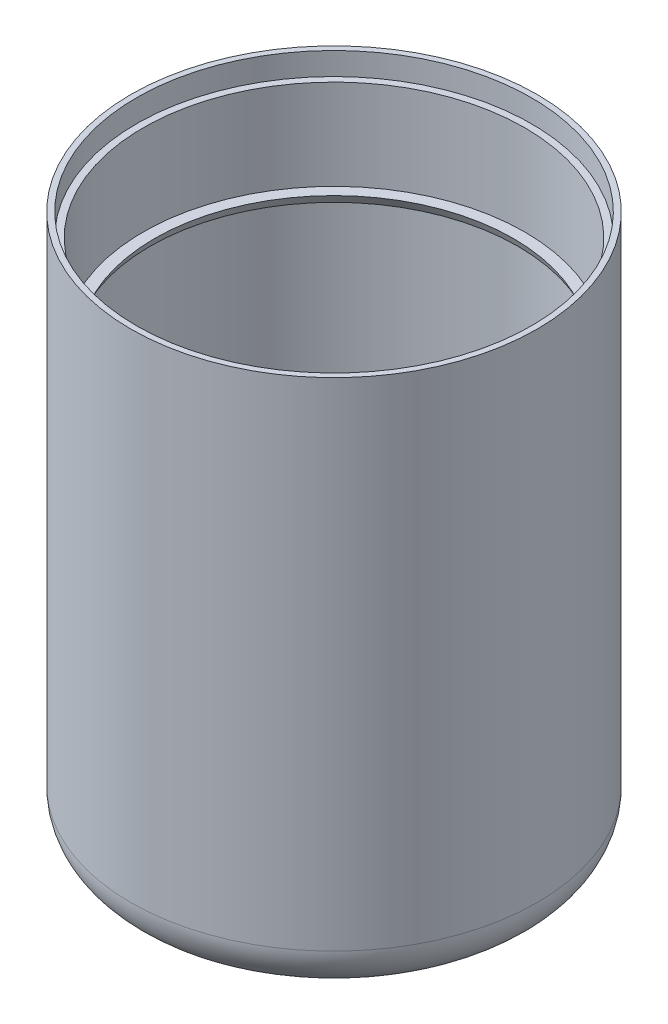
ISO-10303-21;
HEADER;
FILE_DESCRIPTION(('STEP AP214'),'2;1');
FILE_NAME('part.step','',(''),(''),'','','');
FILE_SCHEMA(('AUTOMOTIVE_DESIGN { 1 0 10303 214 1 1 1 1 }'));
ENDSEC;
DATA;
#1=APPLICATION_CONTEXT('core data for automotive mechanical design processes');
#2=APPLICATION_PROTOCOL_DEFINITION('international standard','automotive_design',2000,#1);
#3=PRODUCT_CONTEXT('',#1,'mechanical');
#4=PRODUCT('Part','Part','',(#3));
#5=PRODUCT_RELATED_PRODUCT_CATEGORY('part','',(#4));
#6=PRODUCT_DEFINITION_FORMATION('','',#4);
#7=PRODUCT_DEFINITION_CONTEXT('part definition',#1,'design');
#8=PRODUCT_DEFINITION('design','',#6,#7);
#9=PRODUCT_DEFINITION_SHAPE('','',#8);
#10=(LENGTH_UNIT() NAMED_UNIT(*) SI_UNIT(.MILLI.,.METRE.));
#11=(NAMED_UNIT(*) PLANE_ANGLE_UNIT() SI_UNIT($,.RADIAN.));
#12=(NAMED_UNIT(*) SI_UNIT($,.STERADIAN.) SOLID_ANGLE_UNIT());
#13=UNCERTAINTY_MEASURE_WITH_UNIT(LENGTH_MEASURE(1.E-05),#10,'distance_accuracy_value','');
#14=(GEOMETRIC_REPRESENTATION_CONTEXT(3) GLOBAL_UNCERTAINTY_ASSIGNED_CONTEXT((#13)) GLOBAL_UNIT_ASSIGNED_CONTEXT((#10,
#11,#12)) REPRESENTATION_CONTEXT('',''));
#15=CARTESIAN_POINT('',(0.,0.,0.));
#16=DIRECTION('',(0.,0.,1.));
#17=DIRECTION('',(1.,0.,0.));
#18=AXIS2_PLACEMENT_3D('',#15,#16,#17);
#19=CARTESIAN_POINT('',(0.,48.8080404796562,0.));
#20=DIRECTION('',(0.,1.,0.));
#21=DIRECTION('',(0.,0.,1.));
#22=AXIS2_PLACEMENT_3D('',#19,#20,#21);
#23=CYLINDRICAL_SURFACE('',#22,45.);
#24=CARTESIAN_POINT('',(0.,-7.,-45.));
#25=CARTESIAN_POINT('',(0.168310772412375,-7.00000739664471,-44.9999986739539));
#26=CARTESIAN_POINT('',(0.336738816143234,-7.01421186288798,-44.9990456232156));
#27=CARTESIAN_POINT('',(0.668942560382783,-7.07067147920369,-44.9953353411301));
#28=CARTESIAN_POINT('',(0.83271264204624,-7.11295912390083,-44.9925760198272));
#29=CARTESIAN_POINT('',(1.15074050207909,-7.22436362536326,-44.9855652903156));
#30=CARTESIAN_POINT('',(1.30500331209652,-7.29346614678751,-44.9813146794725));
#31=CARTESIAN_POINT('',(1.59970039584897,-7.45651515151363,-44.9717991985665));
#32=CARTESIAN_POINT('',(1.7401377895456,-7.55045601186526,-44.9665345581348));
#33=CARTESIAN_POINT('',(2.00347379837653,-7.76068780174807,-44.9555726925818));
#34=CARTESIAN_POINT('',(2.12634602003576,-7.87701176153062,-44.9498748357835));
#35=CARTESIAN_POINT('',(2.35083790313255,-8.12863921538396,-44.9386940934982));
#36=CARTESIAN_POINT('',(2.45245666867831,-8.2639435091267,-44.9332112170811));
#37=CARTESIAN_POINT('',(2.63164038098009,-8.54984287398833,-44.9230738010164));
#38=CARTESIAN_POINT('',(2.70918308797913,-8.70045191313798,-44.9184200289175));
#39=CARTESIAN_POINT('',(2.8378712921748,-9.01258772349034,-44.9104739180579));
#40=CARTESIAN_POINT('',(2.88901710538416,-9.17411436396584,-44.907181562999));
#41=CARTESIAN_POINT('',(2.96338559817866,-9.50324333382937,-44.9023356529058));
#42=CARTESIAN_POINT('',(2.98665004928268,-9.67083618580105,-44.9007794969612));
#43=CARTESIAN_POINT('',(3.0047243925241,-10.0075548931784,-44.8995736891329));
#44=CARTESIAN_POINT('',(2.99953464437275,-10.1766807291775,-44.8999240131478));
#45=CARTESIAN_POINT('',(2.96088254031824,-10.5113796280459,-44.9024892451457));
#46=CARTESIAN_POINT('',(2.92746542023376,-10.676957940938,-44.904701169797));
#47=CARTESIAN_POINT('',(2.83337734677405,-11.0001498712854,-44.9107356473475));
#48=CARTESIAN_POINT('',(2.77270621176627,-11.1577634356525,-44.9145582109807));
#49=CARTESIAN_POINT('',(2.62578111033229,-11.4606969233812,-44.9233866374691));
#50=CARTESIAN_POINT('',(2.53950666352314,-11.6060068848923,-44.9283934469627));
#51=CARTESIAN_POINT('',(2.34383877876966,-11.8800994375337,-44.9390252169622));
#52=CARTESIAN_POINT('',(2.23444504394235,-12.0088818163932,-44.9446501854056));
#53=CARTESIAN_POINT('',(1.99538928249837,-12.2465267041827,-44.9558976521431));
#54=CARTESIAN_POINT('',(1.86568811459493,-12.3553498445859,-44.9615201241895));
#55=CARTESIAN_POINT('',(1.58983632497056,-12.5496833711595,-44.9721184703939));
#56=CARTESIAN_POINT('',(1.44368569673034,-12.6351937480905,-44.9770943442956));
#57=CARTESIAN_POINT('',(1.13905948420149,-12.7804712462028,-44.9858392857681));
#58=CARTESIAN_POINT('',(0.980583165272391,-12.8402368315431,-44.9896082813374));
#59=CARTESIAN_POINT('',(0.655814988240901,-12.9323016987052,-44.9955138283039));
#60=CARTESIAN_POINT('',(0.489523233995113,-12.9646013454034,-44.9976504013874));
#61=CARTESIAN_POINT('',(0.154186113373804,-13.0007685827697,-45.0000475603078));
#62=CARTESIAN_POINT('',(-0.0148533589405315,-13.0046905947422,-45.0003117369196));
#63=CARTESIAN_POINT('',(-0.351187715026798,-12.9841334911842,-44.9989438929593));
#64=CARTESIAN_POINT('',(-0.518482609141468,-12.9596545441257,-44.9973118836353));
#65=CARTESIAN_POINT('',(-0.846425281588111,-12.8830354589356,-44.9923376680918));
#66=CARTESIAN_POINT('',(-1.00707892952687,-12.8309203348672,-44.9889970085033));
#67=CARTESIAN_POINT('',(-1.31736002404258,-12.7005336829426,-44.9809812262275));
#68=CARTESIAN_POINT('',(-1.46698735791856,-12.622261887782,-44.9763060899027));
#69=CARTESIAN_POINT('',(-1.75121739414985,-12.4416455204174,-44.9661374966078));
#70=CARTESIAN_POINT('',(-1.88579698804049,-12.3392646534194,-44.960642810471));
#71=CARTESIAN_POINT('',(-2.13587858293946,-12.1133891172881,-44.9494574320514));
#72=CARTESIAN_POINT('',(-2.25138037086135,-11.9898942123562,-44.9437667375803));
#73=CARTESIAN_POINT('',(-2.46021244645348,-11.7250611296198,-44.9328202762595));
#74=CARTESIAN_POINT('',(-2.55350739106986,-11.5836950493482,-44.927565211279));
#75=CARTESIAN_POINT('',(-2.71503562232214,-11.2872724732904,-44.9180938633177));
#76=CARTESIAN_POINT('',(-2.78326908071165,-11.1322160713369,-44.9138775732179));
#77=CARTESIAN_POINT('',(-2.89267641518368,-10.8129427261022,-44.9069643438698));
#78=CARTESIAN_POINT('',(-2.93387242774451,-10.6487333964543,-44.9042661619536));
#79=CARTESIAN_POINT('',(-2.98810772460007,-10.315710005335,-44.9006899992897));
#80=CARTESIAN_POINT('',(-3.00114733434121,-10.1468959971098,-44.8998119975035));
#81=CARTESIAN_POINT('',(-2.99869645060436,-9.80980663109155,-44.8999757225186));
#82=CARTESIAN_POINT('',(-2.98326151391727,-9.64153086473065,-44.9010137110264));
#83=CARTESIAN_POINT('',(-2.92441498278543,-9.3099661975971,-44.9048845276191));
#84=CARTESIAN_POINT('',(-2.88100333884062,-9.14667730564841,-44.9077173588797));
#85=CARTESIAN_POINT('',(-2.76744851334852,-8.82971411720811,-44.914857708161));
#86=CARTESIAN_POINT('',(-2.69730571400754,-8.67603968328401,-44.9191652050966));
#87=CARTESIAN_POINT('',(-2.53228694212582,-8.3826407742445,-44.9287694439466));
#88=CARTESIAN_POINT('',(-2.43741156522086,-8.24291596329175,-44.9340661620366));
#89=CARTESIAN_POINT('',(-2.22541432483089,-7.98110008300132,-44.9450640887664));
#90=CARTESIAN_POINT('',(-2.108252023749,-7.8590417880043,-44.9507660206639));
#91=CARTESIAN_POINT('',(-1.85506627966413,-7.63628197219837,-44.9619255640595));
#92=CARTESIAN_POINT('',(-1.71903823833992,-7.53558567332871,-44.9673831155621));
#93=CARTESIAN_POINT('',(-1.43180879651668,-7.35832354736249,-44.9774453236686));
#94=CARTESIAN_POINT('',(-1.28058722391154,-7.28179037441845,-44.982048822669));
#95=CARTESIAN_POINT('',(-0.967518646258061,-7.15529491230508,-44.9898691308766));
#96=CARTESIAN_POINT('',(-0.805684294150342,-7.10530160588927,-44.9930875579858));
#97=CARTESIAN_POINT('',(-0.535721621316339,-7.04625253123539,-44.9969347133308));
#98=CARTESIAN_POINT('',(-0.429336852485932,-7.02893037004749,-44.99807906537));
#99=CARTESIAN_POINT('',(-0.21531738845897,-7.00580174748219,-44.9996121322942));
#100=CARTESIAN_POINT('',(-0.107682695256217,-6.99999526773821,-45.0000008483844));
#101=CARTESIAN_POINT('',(0.,-7.,-45.));
#102=B_SPLINE_CURVE_WITH_KNOTS('',3,(#24,#25,#26,#27,#28,#29,#30,#31,#32,#33,#34,#35,#36,#37,
#38,#39,#40,#41,#42,#43,#44,#45,#46,#47,#48,#49,#50,#51,#52,#53,#54,#55,#56,#57,#58,#59,#60,#61,
#62,#63,#64,#65,#66,#67,#68,#69,#70,#71,#72,#73,#74,#75,#76,#77,#78,#79,#80,#81,#82,#83,#84,#85,
#86,#87,#88,#89,#90,#91,#92,#93,#94,#95,#96,#97,#98,#99,#100,#101),.UNSPECIFIED.,.T.,.F.,(4,2,2,
2,2,2,2,2,2,2,2,2,2,2,2,2,2,2,2,2,2,2,2,2,2,2,2,2,2,2,2,2,2,2,2,2,2,2,4),(0.,0.504539202132875,
1.00966321855339,1.51451756484974,2.01925771897189,2.52474849986171,3.03026058428982,
3.53623824519497,4.04220984860343,4.54742246005173,5.05262868473679,5.55702682304439,
6.06142832292944,6.56623439192725,7.0710469437127,7.57684474723722,8.08264275122085,
8.58847092510423,9.09429237911222,9.5991435345889,10.1039916953495,10.6083836858095,
11.1127808309915,11.617942226472,12.1231092638885,12.6290749974734,13.1350372634642,
13.6405847624203,14.146126417963,14.6506827523698,15.155239979506,15.6597899926733,
16.1643278558622,16.6697900429335,17.1753756482046,17.6816416081085,18.1873145831146,
18.5101116746006,18.8329082512509),.UNSPECIFIED.);
#103=CARTESIAN_POINT('',(0.,-7.,-45.));
#104=VERTEX_POINT('',#103);
#105=EDGE_CURVE('E105',#104,#104,#102,.T.);
#106=ORIENTED_EDGE('',*,*,#105,.F.);
#107=EDGE_LOOP('',(#106));
#108=FACE_BOUND('',#107,.T.);
#109=CARTESIAN_POINT('',(0.,-55.,0.));
#110=DIRECTION('',(0.,1.,0.));
#111=DIRECTION('',(0.,0.,1.));
#112=AXIS2_PLACEMENT_3D('',#109,#110,#111);
#113=CIRCLE('',#112,45.);
#114=CARTESIAN_POINT('',(0.,-55.,45.));
#115=VERTEX_POINT('',#114);
#116=EDGE_CURVE('E10',#115,#115,#113,.T.);
#117=ORIENTED_EDGE('',*,*,#116,.T.);
#118=EDGE_LOOP('',(#117));
#119=FACE_BOUND('',#118,.T.);
#120=CARTESIAN_POINT('',(0.,55.,0.));
#121=DIRECTION('',(0.,1.,0.));
#122=DIRECTION('',(0.,0.,1.));
#123=AXIS2_PLACEMENT_3D('',#120,#121,#122);
#124=CIRCLE('',#123,45.);
#125=CARTESIAN_POINT('',(0.,55.,45.));
#126=VERTEX_POINT('',#125);
#127=EDGE_CURVE('E102',#126,#126,#124,.T.);
#128=ORIENTED_EDGE('',*,*,#127,.F.);
#129=EDGE_LOOP('',(#128));
#130=FACE_BOUND('',#129,.T.);
#131=ADVANCED_FACE('F32',(#108,#119,#130),#23,.T.);
#132=CARTESIAN_POINT('',(0.,-55.,0.));
#133=DIRECTION('',(0.,1.,0.));
#134=DIRECTION('',(0.,0.,1.));
#135=AXIS2_PLACEMENT_3D('',#132,#133,#134);
#136=TOROIDAL_SURFACE('',#135,35.,10.);
#137=CARTESIAN_POINT('',(0.,-65.,0.));
#138=DIRECTION('',(0.,1.,0.));
#139=DIRECTION('',(0.,0.,1.));
#140=AXIS2_PLACEMENT_3D('',#137,#138,#139);
#141=CIRCLE('',#140,35.);
#142=CARTESIAN_POINT('',(0.,-65.,35.));
#143=VERTEX_POINT('',#142);
#144=EDGE_CURVE('E45',#143,#143,#141,.T.);
#145=ORIENTED_EDGE('',*,*,#144,.T.);
#146=EDGE_LOOP('',(#145));
#147=FACE_BOUND('',#146,.T.);
#148=ORIENTED_EDGE('',*,*,#116,.F.);
#149=EDGE_LOOP('',(#148));
#150=FACE_BOUND('',#149,.T.);
#151=ADVANCED_FACE('F186',(#147,#150),#136,.T.);
#152=CARTESIAN_POINT('',(0.,-65.,0.));
#153=DIRECTION('',(0.,-1.,0.));
#154=DIRECTION('',(0.,0.,-1.));
#155=AXIS2_PLACEMENT_3D('',#152,#153,#154);
#156=PLANE('',#155);
#157=CARTESIAN_POINT('',(0.,-65.,0.));
#158=DIRECTION('',(0.,1.,0.));
#159=DIRECTION('',(0.,0.,1.));
#160=AXIS2_PLACEMENT_3D('',#157,#158,#159);
#161=CIRCLE('',#160,15.);
#162=CARTESIAN_POINT('',(0.,-65.,15.));
#163=VERTEX_POINT('',#162);
#164=EDGE_CURVE('E49',#163,#163,#161,.T.);
#165=ORIENTED_EDGE('',*,*,#164,.T.);
#166=EDGE_LOOP('',(#165));
#167=FACE_BOUND('',#166,.T.);
#168=ORIENTED_EDGE('',*,*,#144,.F.);
#169=EDGE_LOOP('',(#168));
#170=FACE_BOUND('',#169,.T.);
#171=ADVANCED_FACE('F183',(#167,#170),#156,.T.);
#172=CARTESIAN_POINT('',(0.,-75.,0.));
#173=DIRECTION('',(0.,1.,0.));
#174=DIRECTION('',(0.,0.,1.));
#175=AXIS2_PLACEMENT_3D('',#172,#173,#174);
#176=TOROIDAL_SURFACE('',#175,15.,10.);
#177=ORIENTED_EDGE('',*,*,#164,.F.);
#178=EDGE_LOOP('',(#177));
#179=FACE_BOUND('',#178,.T.);
#180=CARTESIAN_POINT('',(0.,-75.,0.));
#181=DIRECTION('',(0.,1.,0.));
#182=DIRECTION('',(0.,0.,1.));
#183=AXIS2_PLACEMENT_3D('',#180,#181,#182);
#184=CIRCLE('',#183,5.);
#185=CARTESIAN_POINT('',(0.,-75.,4.99999999999999));
#186=VERTEX_POINT('',#185);
#187=EDGE_CURVE('E54',#186,#186,#184,.T.);
#188=ORIENTED_EDGE('',*,*,#187,.T.);
#189=EDGE_LOOP('',(#188));
#190=FACE_BOUND('',#189,.T.);
#191=ADVANCED_FACE('F179',(#179,#190),#176,.F.);
#192=CARTESIAN_POINT('',(0.,48.8080404796562,0.));
#193=DIRECTION('',(0.,1.,0.));
#194=DIRECTION('',(0.,0.,1.));
#195=AXIS2_PLACEMENT_3D('',#192,#193,#194);
#196=CYLINDRICAL_SURFACE('',#195,5.);
#197=CARTESIAN_POINT('',(0.,-80.,0.));
#198=DIRECTION('',(0.,1.,0.));
#199=DIRECTION('',(0.,0.,1.));
#200=AXIS2_PLACEMENT_3D('',#197,#198,#199);
#201=CIRCLE('',#200,5.);
#202=CARTESIAN_POINT('',(0.,-80.,4.99999999999998));
#203=VERTEX_POINT('',#202);
#204=EDGE_CURVE('E57',#203,#203,#201,.T.);
#205=ORIENTED_EDGE('',*,*,#204,.T.);
#206=EDGE_LOOP('',(#205));
#207=FACE_BOUND('',#206,.T.);
#208=ORIENTED_EDGE('',*,*,#187,.F.);
#209=EDGE_LOOP('',(#208));
#210=FACE_BOUND('',#209,.T.);
#211=ADVANCED_FACE('F175',(#207,#210),#196,.T.);
#212=CARTESIAN_POINT('',(0.,-80.,0.));
#213=DIRECTION('',(0.,-1.,0.));
#214=DIRECTION('',(0.,0.,-1.));
#215=AXIS2_PLACEMENT_3D('',#212,#213,#214);
#216=PLANE('',#215);
#217=CARTESIAN_POINT('',(0.,-80.,0.));
#218=DIRECTION('',(0.,1.,0.));
#219=DIRECTION('',(0.,0.,1.));
#220=AXIS2_PLACEMENT_3D('',#217,#218,#219);
#221=CIRCLE('',#220,4.);
#222=CARTESIAN_POINT('',(0.,-80.,3.99999999999998));
#223=VERTEX_POINT('',#222);
#224=EDGE_CURVE('E60',#223,#223,#221,.T.);
#225=ORIENTED_EDGE('',*,*,#224,.T.);
#226=EDGE_LOOP('',(#225));
#227=FACE_BOUND('',#226,.T.);
#228=ORIENTED_EDGE('',*,*,#204,.F.);
#229=EDGE_LOOP('',(#228));
#230=FACE_BOUND('',#229,.T.);
#231=ADVANCED_FACE('F171',(#227,#230),#216,.T.);
#232=CARTESIAN_POINT('',(0.,48.8080404796562,0.));
#233=DIRECTION('',(0.,1.,0.));
#234=DIRECTION('',(0.,0.,1.));
#235=AXIS2_PLACEMENT_3D('',#232,#233,#234);
#236=CYLINDRICAL_SURFACE('',#235,4.);
#237=ORIENTED_EDGE('',*,*,#224,.F.);
#238=EDGE_LOOP('',(#237));
#239=FACE_BOUND('',#238,.T.);
#240=CARTESIAN_POINT('',(0.,-70.,0.));
#241=DIRECTION('',(0.,1.,0.));
#242=DIRECTION('',(0.,0.,1.));
#243=AXIS2_PLACEMENT_3D('',#240,#241,#242);
#244=CIRCLE('',#243,4.);
#245=CARTESIAN_POINT('',(0.,-70.,3.99999999999999));
#246=VERTEX_POINT('',#245);
#247=EDGE_CURVE('E63',#246,#246,#244,.T.);
#248=ORIENTED_EDGE('',*,*,#247,.T.);
#249=EDGE_LOOP('',(#248));
#250=FACE_BOUND('',#249,.T.);
#251=ADVANCED_FACE('F167',(#239,#250),#236,.F.);
#252=CARTESIAN_POINT('',(0.,-70.,0.));
#253=DIRECTION('',(0.,1.,0.));
#254=DIRECTION('',(0.,0.,1.));
#255=AXIS2_PLACEMENT_3D('',#252,#253,#254);
#256=TOROIDAL_SURFACE('',#255,14.,10.);
#257=ORIENTED_EDGE('',*,*,#247,.F.);
#258=EDGE_LOOP('',(#257));
#259=FACE_BOUND('',#258,.T.);
#260=CARTESIAN_POINT('',(0.,-60.,0.));
#261=DIRECTION('',(0.,1.,0.));
#262=DIRECTION('',(0.,0.,1.));
#263=AXIS2_PLACEMENT_3D('',#260,#261,#262);
#264=CIRCLE('',#263,14.);
#265=CARTESIAN_POINT('',(0.,-60.,14.));
#266=VERTEX_POINT('',#265);
#267=EDGE_CURVE('E66',#266,#266,#264,.T.);
#268=ORIENTED_EDGE('',*,*,#267,.T.);
#269=EDGE_LOOP('',(#268));
#270=FACE_BOUND('',#269,.T.);
#271=ADVANCED_FACE('F163',(#259,#270),#256,.T.);
#272=CARTESIAN_POINT('',(0.,-60.,0.));
#273=DIRECTION('',(0.,-1.,0.));
#274=DIRECTION('',(0.,0.,-1.));
#275=AXIS2_PLACEMENT_3D('',#272,#273,#274);
#276=PLANE('',#275);
#277=ORIENTED_EDGE('',*,*,#267,.F.);
#278=EDGE_LOOP('',(#277));
#279=FACE_BOUND('',#278,.T.);
#280=CARTESIAN_POINT('',(0.,-60.,0.));
#281=DIRECTION('',(0.,1.,0.));
#282=DIRECTION('',(0.,0.,1.));
#283=AXIS2_PLACEMENT_3D('',#280,#281,#282);
#284=CIRCLE('',#283,30.);
#285=CARTESIAN_POINT('',(0.,-60.,30.));
#286=VERTEX_POINT('',#285);
#287=EDGE_CURVE('E69',#286,#286,#284,.T.);
#288=ORIENTED_EDGE('',*,*,#287,.T.);
#289=EDGE_LOOP('',(#288));
#290=FACE_BOUND('',#289,.T.);
#291=ADVANCED_FACE('F159',(#279,#290),#276,.F.);
#292=CARTESIAN_POINT('',(0.,-50.,0.));
#293=DIRECTION('',(0.,1.,0.));
#294=DIRECTION('',(0.,0.,1.));
#295=AXIS2_PLACEMENT_3D('',#292,#293,#294);
#296=TOROIDAL_SURFACE('',#295,30.,10.);
#297=ORIENTED_EDGE('',*,*,#287,.F.);
#298=EDGE_LOOP('',(#297));
#299=FACE_BOUND('',#298,.T.);
#300=CARTESIAN_POINT('',(0.,-50.,0.));
#301=DIRECTION('',(0.,1.,0.));
#302=DIRECTION('',(0.,0.,1.));
#303=AXIS2_PLACEMENT_3D('',#300,#301,#302);
#304=CIRCLE('',#303,40.);
#305=CARTESIAN_POINT('',(0.,-50.,40.));
#306=VERTEX_POINT('',#305);
#307=EDGE_CURVE('E72',#306,#306,#304,.T.);
#308=ORIENTED_EDGE('',*,*,#307,.T.);
#309=EDGE_LOOP('',(#308));
#310=FACE_BOUND('',#309,.T.);
#311=ADVANCED_FACE('F155',(#299,#310),#296,.F.);
#312=CARTESIAN_POINT('',(0.,48.8080404796562,0.));
#313=DIRECTION('',(0.,1.,0.));
#314=DIRECTION('',(0.,0.,1.));
#315=AXIS2_PLACEMENT_3D('',#312,#313,#314);
#316=CYLINDRICAL_SURFACE('',#315,40.);
#317=ORIENTED_EDGE('',*,*,#307,.F.);
#318=EDGE_LOOP('',(#317));
#319=FACE_BOUND('',#318,.T.);
#320=CARTESIAN_POINT('',(0.,-18.0310889132456,0.));
#321=DIRECTION('',(0.,1.,0.));
#322=DIRECTION('',(0.,0.,1.));
#323=AXIS2_PLACEMENT_3D('',#320,#321,#322);
#324=CIRCLE('',#323,40.);
#325=CARTESIAN_POINT('',(0.,-18.0310889132456,40.));
#326=VERTEX_POINT('',#325);
#327=EDGE_CURVE('E75',#326,#326,#324,.T.);
#328=ORIENTED_EDGE('',*,*,#327,.T.);
#329=EDGE_LOOP('',(#328));
#330=FACE_BOUND('',#329,.T.);
#331=ADVANCED_FACE('F151',(#319,#330),#316,.F.);
#332=CARTESIAN_POINT('',(0.,-18.0310889132456,0.));
#333=DIRECTION('',(0.,-1.,0.));
#334=DIRECTION('',(0.,0.,-1.));
#335=AXIS2_PLACEMENT_3D('',#332,#333,#334);
#336=CONICAL_SURFACE('',#335,40.,0.523598775598294);
#337=CARTESIAN_POINT('',(0.,-15.,0.));
#338=DIRECTION('',(0.,1.,0.));
#339=DIRECTION('',(0.,0.,1.));
#340=AXIS2_PLACEMENT_3D('',#337,#338,#339);
#341=CIRCLE('',#340,38.25);
#342=CARTESIAN_POINT('',(0.,-15.,38.25));
#343=VERTEX_POINT('',#342);
#344=EDGE_CURVE('E78',#343,#343,#341,.T.);
#345=ORIENTED_EDGE('',*,*,#344,.T.);
#346=EDGE_LOOP('',(#345));
#347=FACE_BOUND('',#346,.T.);
#348=ORIENTED_EDGE('',*,*,#327,.F.);
#349=EDGE_LOOP('',(#348));
#350=FACE_BOUND('',#349,.T.);
#351=ADVANCED_FACE('F147',(#347,#350),#336,.F.);
#352=CARTESIAN_POINT('',(0.,-15.,0.));
#353=DIRECTION('',(0.,-1.,0.));
#354=DIRECTION('',(0.,0.,-1.));
#355=AXIS2_PLACEMENT_3D('',#352,#353,#354);
#356=PLANE('',#355);
#357=ORIENTED_EDGE('',*,*,#344,.F.);
#358=EDGE_LOOP('',(#357));
#359=FACE_BOUND('',#358,.T.);
#360=CARTESIAN_POINT('',(0.,-15.,0.));
#361=DIRECTION('',(0.,1.,0.));
#362=DIRECTION('',(0.,0.,1.));
#363=AXIS2_PLACEMENT_3D('',#360,#361,#362);
#364=CIRCLE('',#363,40.75);
#365=CARTESIAN_POINT('',(0.,-15.,40.75));
#366=VERTEX_POINT('',#365);
#367=EDGE_CURVE('E81',#366,#366,#364,.T.);
#368=ORIENTED_EDGE('',*,*,#367,.T.);
#369=EDGE_LOOP('',(#368));
#370=FACE_BOUND('',#369,.T.);
#371=ADVANCED_FACE('F143',(#359,#370),#356,.F.);
#372=CARTESIAN_POINT('',(0.,48.8080404796562,0.));
#373=DIRECTION('',(0.,1.,0.));
#374=DIRECTION('',(0.,0.,1.));
#375=AXIS2_PLACEMENT_3D('',#372,#373,#374);
#376=CYLINDRICAL_SURFACE('',#375,40.75);
#377=CARTESIAN_POINT('',(3.,-10.,-40.6394205175221));
#378=CARTESIAN_POINT('',(2.99999262165069,-9.83173384455911,-40.6394219898881));
#379=CARTESIAN_POINT('',(2.98579565050903,-9.66335149558262,-40.6404768125733));
#380=CARTESIAN_POINT('',(2.92936755805399,-9.33124096402678,-40.6445823583363));
#381=CARTESIAN_POINT('',(2.88710423735836,-9.16751835262296,-40.6476353738014));
#382=CARTESIAN_POINT('',(2.77576816364691,-8.84958573700683,-40.655389638735));
#383=CARTESIAN_POINT('',(2.70671008386514,-8.69537057983526,-40.6600899859625));
#384=CARTESIAN_POINT('',(2.54376974857311,-8.40075932523212,-40.6706081639186));
#385=CARTESIAN_POINT('',(2.44989298912572,-8.26036017769814,-40.6764257471589));
#386=CARTESIAN_POINT('',(2.23977272907887,-7.99704239040642,-40.6885362166322));
#387=CARTESIAN_POINT('',(2.12348929182126,-7.87415565468569,-40.6948299391633));
#388=CARTESIAN_POINT('',(1.87194023933405,-7.64962463872306,-40.7071758277994));
#389=CARTESIAN_POINT('',(1.73667381421497,-7.54798126526796,-40.7132279835841));
#390=CARTESIAN_POINT('',(1.45081248858947,-7.36871950064068,-40.7244164508236));
#391=CARTESIAN_POINT('',(1.30020055324248,-7.29112820407068,-40.7295517266752));
#392=CARTESIAN_POINT('',(0.98804265852484,-7.16234648688884,-40.7383188911957));
#393=CARTESIAN_POINT('',(0.826496853218318,-7.11115569436722,-40.7419508010427));
#394=CARTESIAN_POINT('',(0.497370261852595,-7.03671854167681,-40.7472961951388));
#395=CARTESIAN_POINT('',(0.329801053725394,-7.01342124430312,-40.7490131759072));
#396=CARTESIAN_POINT('',(-0.00687759656078885,-6.99527502104656,-40.7503470696867));
#397=CARTESIAN_POINT('',(-0.175987015694354,-7.00042567057517,-40.7499640140412));
#398=CARTESIAN_POINT('',(-0.510600497976605,-7.0389873038144,-40.7471438957209));
#399=CARTESIAN_POINT('',(-0.676110912521225,-7.07234350574347,-40.7447108147078));
#400=CARTESIAN_POINT('',(-0.999177207146296,-7.16628428651725,-40.7380690207872));
#401=CARTESIAN_POINT('',(-1.15673302576623,-7.22686907570554,-40.7338602941626));
#402=CARTESIAN_POINT('',(-1.45959280272688,-7.3736087985569,-40.7241340294905));
#403=CARTESIAN_POINT('',(-1.60488476074584,-7.45978841293305,-40.718615229194));
#404=CARTESIAN_POINT('',(-1.87896150307889,-7.65525353094562,-40.7068894681935));
#405=CARTESIAN_POINT('',(-2.00774602724397,-7.7645393986533,-40.7006824966472));
#406=CARTESIAN_POINT('',(-2.24547220239194,-8.00342387563032,-40.6882610702177));
#407=CARTESIAN_POINT('',(-2.35436605323591,-8.13307005982481,-40.6820466325156));
#408=CARTESIAN_POINT('',(-2.54885086999739,-8.40882875546141,-40.6703255752519));
#409=CARTESIAN_POINT('',(-2.63444182225562,-8.5549412765554,-40.664818956105));
#410=CARTESIAN_POINT('',(-2.77988861625389,-8.85951701951928,-40.6551357039132));
#411=CARTESIAN_POINT('',(-2.83974221198876,-9.01798131785886,-40.6509591869496));
#412=CARTESIAN_POINT('',(-2.93198108140875,-9.3427474341509,-40.64441097807));
#413=CARTESIAN_POINT('',(-2.96436680450038,-9.50904912382748,-40.6420392566256));
#414=CARTESIAN_POINT('',(-3.00069058741151,-9.84435172172402,-40.6393736880357));
#415=CARTESIAN_POINT('',(-3.00469519821804,-10.0133453834054,-40.6390749799071));
#416=CARTESIAN_POINT('',(-2.98431718566858,-10.3496018106291,-40.6405764139932));
#417=CARTESIAN_POINT('',(-2.95993476821304,-10.5168645887172,-40.6423765409845));
#418=CARTESIAN_POINT('',(-2.88353020800713,-10.8447216572678,-40.6478683664429));
#419=CARTESIAN_POINT('',(-2.83153891850951,-11.0053231762049,-40.6515579532518));
#420=CARTESIAN_POINT('',(-2.70142376160701,-11.3155223551609,-40.6604111780895));
#421=CARTESIAN_POINT('',(-2.6232995658713,-11.465119876898,-40.6655748346381));
#422=CARTESIAN_POINT('',(-2.44296701696458,-11.749369664119,-40.6768061412405));
#423=CARTESIAN_POINT('',(-2.34071419270717,-11.8839936498201,-40.6828754528066));
#424=CARTESIAN_POINT('',(-2.11509144395345,-12.1341895376817,-40.6952284581903));
#425=CARTESIAN_POINT('',(-1.99172123491874,-12.2497611830872,-40.7015121548958));
#426=CARTESIAN_POINT('',(-1.72707873362075,-12.4587977150358,-40.7136002428009));
#427=CARTESIAN_POINT('',(-1.58577230662854,-12.5522194490648,-40.719403684285));
#428=CARTESIAN_POINT('',(-1.28943939536873,-12.7140085813863,-40.7298637014857));
#429=CARTESIAN_POINT('',(-1.13441302211297,-12.7823761823757,-40.7345202864807));
#430=CARTESIAN_POINT('',(-0.815197486099716,-12.892041752133,-40.7421574742998));
#431=CARTESIAN_POINT('',(-0.651017640003095,-12.9333667188817,-40.7451397482464));
#432=CARTESIAN_POINT('',(-0.318026974253562,-12.9878622528444,-40.7490990207439));
#433=CARTESIAN_POINT('',(-0.149216221150139,-13.0010332244372,-40.7500760480964));
#434=CARTESIAN_POINT('',(0.187818140595977,-12.9988426116166,-40.7499148110561));
#435=CARTESIAN_POINT('',(0.35604219376311,-12.9835484162743,-40.7487815426213));
#436=CARTESIAN_POINT('',(0.687526198528175,-12.9250017451961,-40.7445369872548));
#437=CARTESIAN_POINT('',(0.850786142279721,-12.881749225271,-40.7414256971968));
#438=CARTESIAN_POINT('',(1.1677146617946,-12.7685299274729,-40.7335744838568));
#439=CARTESIAN_POINT('',(1.32138351700006,-12.6985639283362,-40.7288346080509));
#440=CARTESIAN_POINT('',(1.61480362920689,-12.533912067065,-40.7182574521048));
#441=CARTESIAN_POINT('',(1.754555176555,-12.4392267207816,-40.7124201948659));
#442=CARTESIAN_POINT('',(2.01651751740196,-12.2275720625719,-40.700287725755));
#443=CARTESIAN_POINT('',(2.13868829396313,-12.1105532802581,-40.693991516773));
#444=CARTESIAN_POINT('',(2.36169890587098,-11.8576345997654,-40.6816591108688));
#445=CARTESIAN_POINT('',(2.46253354162847,-11.7217301125033,-40.6756229776115));
#446=CARTESIAN_POINT('',(2.64011458432091,-11.4346890940687,-40.664483871371));
#447=CARTESIAN_POINT('',(2.71682335923491,-11.2835292475631,-40.659382361356));
#448=CARTESIAN_POINT('',(2.84367588040044,-10.9705444681281,-40.6507083307048));
#449=CARTESIAN_POINT('',(2.89385045580513,-10.8087321589217,-40.647134036582));
#450=CARTESIAN_POINT('',(2.95329959288486,-10.5382892891131,-40.642847184601));
#451=CARTESIAN_POINT('',(2.97078928565064,-10.431402673208,-40.6415680083844));
#452=CARTESIAN_POINT('',(2.99414184984277,-10.2163600525038,-40.6398542022902));
#453=CARTESIAN_POINT('',(3.0000047446694,-10.1082040502598,-40.6394195707128));
#454=CARTESIAN_POINT('',(3.,-10.,-40.6394205175221));
#455=B_SPLINE_CURVE_WITH_KNOTS('',3,(#377,#378,#379,#380,#381,#382,#383,#384,#385,#386,#387,
#388,#389,#390,#391,#392,#393,#394,#395,#396,#397,#398,#399,#400,#401,#402,#403,#404,#405,#406,
#407,#408,#409,#410,#411,#412,#413,#414,#415,#416,#417,#418,#419,#420,#421,#422,#423,#424,#425,
#426,#427,#428,#429,#430,#431,#432,#433,#434,#435,#436,#437,#438,#439,#440,#441,#442,#443,#444,
#445,#446,#447,#448,#449,#450,#451,#452,#453,#454),.UNSPECIFIED.,.T.,.F.,(4,2,2,2,2,2,2,2,2,2,2,
2,2,2,2,2,2,2,2,2,2,2,2,2,2,2,2,2,2,2,2,2,2,2,2,2,2,2,4),(0.,0.504403424369779,1.0093865323246,
1.51409349294915,2.01868878038663,2.52419189690521,3.02971658674999,3.5358086965491,
4.0418936767211,4.54705306240433,5.05220490855254,5.55637787922463,6.06055474475055,
6.56521936789943,7.06989194333615,7.57576180574271,8.08163196467066,8.58754626008671,
9.09345227799366,9.59817160110253,10.102887263339,10.6070400829365,11.1111992368903,
11.6162949579304,12.121397485232,12.6274761140676,13.1335506484567,13.6391191700157,
14.1446804299909,14.6490463351235,15.1534130374269,15.6577650378369,16.1621065141103,
16.667578393548,17.1731733142996,17.6795530055793,18.1853430522713,18.5097018229619,
18.8340599408419),.UNSPECIFIED.);
#456=CARTESIAN_POINT('',(3.,-10.,-40.6394205175221));
#457=VERTEX_POINT('',#456);
#458=EDGE_CURVE('E36',#457,#457,#455,.T.);
#459=ORIENTED_EDGE('',*,*,#458,.F.);
#460=EDGE_LOOP('',(#459));
#461=FACE_BOUND('',#460,.T.);
#462=CARTESIAN_POINT('',(0.,28.,0.));
#463=DIRECTION('',(0.,1.,0.));
#464=DIRECTION('',(0.,0.,1.));
#465=AXIS2_PLACEMENT_3D('',#462,#463,#464);
#466=CIRCLE('',#465,40.75);
#467=CARTESIAN_POINT('',(0.,28.,40.75));
#468=VERTEX_POINT('',#467);
#469=EDGE_CURVE('E84',#468,#468,#466,.T.);
#470=ORIENTED_EDGE('',*,*,#469,.T.);
#471=EDGE_LOOP('',(#470));
#472=FACE_BOUND('',#471,.T.);
#473=ORIENTED_EDGE('',*,*,#367,.F.);
#474=EDGE_LOOP('',(#473));
#475=FACE_BOUND('',#474,.T.);
#476=ADVANCED_FACE('F138',(#461,#472,#475),#376,.F.);
#477=CARTESIAN_POINT('',(0.,28.,0.));
#478=DIRECTION('',(0.,-1.,0.));
#479=DIRECTION('',(0.,0.,-1.));
#480=AXIS2_PLACEMENT_3D('',#477,#478,#479);
#481=CONICAL_SURFACE('',#480,40.75,0.463647609000807);
#482=CARTESIAN_POINT('',(0.,30.,0.));
#483=DIRECTION('',(0.,1.,0.));
#484=DIRECTION('',(0.,0.,1.));
#485=AXIS2_PLACEMENT_3D('',#482,#483,#484);
#486=CIRCLE('',#485,39.75);
#487=CARTESIAN_POINT('',(0.,30.,39.75));
#488=VERTEX_POINT('',#487);
#489=EDGE_CURVE('E87',#488,#488,#486,.T.);
#490=ORIENTED_EDGE('',*,*,#489,.T.);
#491=EDGE_LOOP('',(#490));
#492=FACE_BOUND('',#491,.T.);
#493=ORIENTED_EDGE('',*,*,#469,.F.);
#494=EDGE_LOOP('',(#493));
#495=FACE_BOUND('',#494,.T.);
#496=ADVANCED_FACE('F135',(#492,#495),#481,.F.);
#497=CARTESIAN_POINT('',(0.,30.,0.));
#498=DIRECTION('',(0.,-1.,0.));
#499=DIRECTION('',(0.,0.,-1.));
#500=AXIS2_PLACEMENT_3D('',#497,#498,#499);
#501=PLANE('',#500);
#502=ORIENTED_EDGE('',*,*,#489,.F.);
#503=EDGE_LOOP('',(#502));
#504=FACE_BOUND('',#503,.T.);
#505=CARTESIAN_POINT('',(0.,30.,0.));
#506=DIRECTION('',(0.,1.,0.));
#507=DIRECTION('',(0.,0.,1.));
#508=AXIS2_PLACEMENT_3D('',#505,#506,#507);
#509=CIRCLE('',#508,42.25);
#510=CARTESIAN_POINT('',(0.,30.,42.25));
#511=VERTEX_POINT('',#510);
#512=EDGE_CURVE('E90',#511,#511,#509,.T.);
#513=ORIENTED_EDGE('',*,*,#512,.T.);
#514=EDGE_LOOP('',(#513));
#515=FACE_BOUND('',#514,.T.);
#516=ADVANCED_FACE('F131',(#504,#515),#501,.F.);
#517=CARTESIAN_POINT('',(0.,48.8080404796562,0.));
#518=DIRECTION('',(0.,1.,0.));
#519=DIRECTION('',(0.,0.,1.));
#520=AXIS2_PLACEMENT_3D('',#517,#518,#519);
#521=CYLINDRICAL_SURFACE('',#520,42.25);
#522=CARTESIAN_POINT('',(0.,50.,0.));
#523=DIRECTION('',(0.,1.,0.));
#524=DIRECTION('',(0.,0.,1.));
#525=AXIS2_PLACEMENT_3D('',#522,#523,#524);
#526=CIRCLE('',#525,42.25);
#527=CARTESIAN_POINT('',(0.,50.,42.25));
#528=VERTEX_POINT('',#527);
#529=EDGE_CURVE('E93',#528,#528,#526,.T.);
#530=ORIENTED_EDGE('',*,*,#529,.T.);
#531=EDGE_LOOP('',(#530));
#532=FACE_BOUND('',#531,.T.);
#533=ORIENTED_EDGE('',*,*,#512,.F.);
#534=EDGE_LOOP('',(#533));
#535=FACE_BOUND('',#534,.T.);
#536=ADVANCED_FACE('F127',(#532,#535),#521,.F.);
#537=CARTESIAN_POINT('',(0.,50.,0.));
#538=DIRECTION('',(0.,-1.,0.));
#539=DIRECTION('',(0.,0.,-1.));
#540=AXIS2_PLACEMENT_3D('',#537,#538,#539);
#541=PLANE('',#540);
#542=ORIENTED_EDGE('',*,*,#529,.F.);
#543=EDGE_LOOP('',(#542));
#544=FACE_BOUND('',#543,.T.);
#545=CARTESIAN_POINT('',(0.,50.,0.));
#546=DIRECTION('',(0.,1.,0.));
#547=DIRECTION('',(0.,0.,1.));
#548=AXIS2_PLACEMENT_3D('',#545,#546,#547);
#549=CIRCLE('',#548,43.75);
#550=CARTESIAN_POINT('',(0.,50.,43.75));
#551=VERTEX_POINT('',#550);
#552=EDGE_CURVE('E96',#551,#551,#549,.T.);
#553=ORIENTED_EDGE('',*,*,#552,.T.);
#554=EDGE_LOOP('',(#553));
#555=FACE_BOUND('',#554,.T.);
#556=ADVANCED_FACE('F123',(#544,#555),#541,.F.);
#557=CARTESIAN_POINT('',(0.,48.8080404796562,0.));
#558=DIRECTION('',(0.,1.,0.));
#559=DIRECTION('',(0.,0.,1.));
#560=AXIS2_PLACEMENT_3D('',#557,#558,#559);
#561=CYLINDRICAL_SURFACE('',#560,43.75);
#562=CARTESIAN_POINT('',(0.,55.,0.));
#563=DIRECTION('',(0.,1.,0.));
#564=DIRECTION('',(0.,0.,1.));
#565=AXIS2_PLACEMENT_3D('',#562,#563,#564);
#566=CIRCLE('',#565,43.75);
#567=CARTESIAN_POINT('',(0.,55.,43.75));
#568=VERTEX_POINT('',#567);
#569=EDGE_CURVE('E99',#568,#568,#566,.T.);
#570=ORIENTED_EDGE('',*,*,#569,.T.);
#571=EDGE_LOOP('',(#570));
#572=FACE_BOUND('',#571,.T.);
#573=ORIENTED_EDGE('',*,*,#552,.F.);
#574=EDGE_LOOP('',(#573));
#575=FACE_BOUND('',#574,.T.);
#576=ADVANCED_FACE('F119',(#572,#575),#561,.F.);
#577=CARTESIAN_POINT('',(0.,55.,0.));
#578=DIRECTION('',(0.,-1.,0.));
#579=DIRECTION('',(0.,0.,-1.));
#580=AXIS2_PLACEMENT_3D('',#577,#578,#579);
#581=PLANE('',#580);
#582=ORIENTED_EDGE('',*,*,#569,.F.);
#583=EDGE_LOOP('',(#582));
#584=FACE_BOUND('',#583,.T.);
#585=ORIENTED_EDGE('',*,*,#127,.T.);
#586=EDGE_LOOP('',(#585));
#587=FACE_BOUND('',#586,.T.);
#588=ADVANCED_FACE('F114',(#584,#587),#581,.F.);
#589=CARTESIAN_POINT('',(0.,-10.,-45.));
#590=DIRECTION('',(0.,0.,1.));
#591=DIRECTION('',(1.,0.,0.));
#592=AXIS2_PLACEMENT_3D('',#589,#590,#591);
#593=CYLINDRICAL_SURFACE('',#592,3.);
#594=ORIENTED_EDGE('',*,*,#105,.T.);
#595=EDGE_LOOP('',(#594));
#596=FACE_BOUND('',#595,.T.);
#597=ORIENTED_EDGE('',*,*,#458,.T.);
#598=EDGE_LOOP('',(#597));
#599=FACE_BOUND('',#598,.T.);
#600=ADVANCED_FACE('F110',(#596,#599),#593,.F.);
#601=CLOSED_SHELL('',(#131,#151,#171,#191,#211,#231,#251,#271,#291,#311,#331,#351,#371,#476,
#496,#516,#536,#556,#576,#588,#600));
#602=MANIFOLD_SOLID_BREP('B2',#601);
#603=ADVANCED_BREP_SHAPE_REPRESENTATION('',(#18,#602),#14);
#604=SHAPE_DEFINITION_REPRESENTATION(#9,#603);
ENDSEC;
END-ISO-10303-21;
